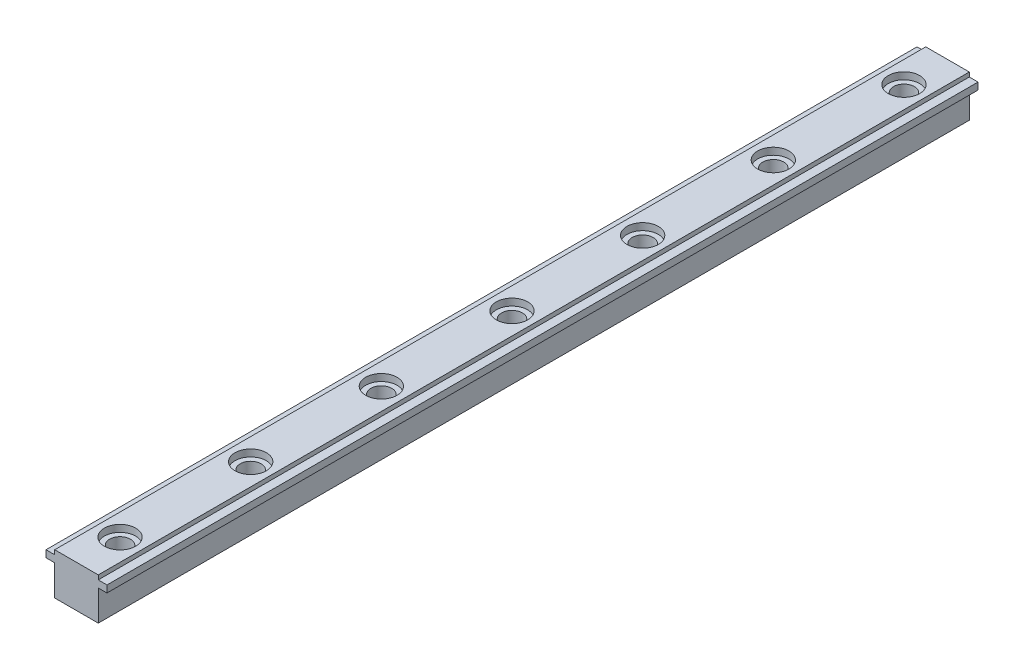
ISO-10303-21;
HEADER;
FILE_DESCRIPTION(('STEP AP214'),'2;1');
FILE_NAME('part.step','',(''),(''),'','','');
FILE_SCHEMA(('AUTOMOTIVE_DESIGN { 1 0 10303 214 1 1 1 1 }'));
ENDSEC;
DATA;
#1=APPLICATION_CONTEXT('core data for automotive mechanical design processes');
#2=APPLICATION_PROTOCOL_DEFINITION('international standard','automotive_design',2000,#1);
#3=PRODUCT_CONTEXT('',#1,'mechanical');
#4=PRODUCT('Part','Part','',(#3));
#5=PRODUCT_RELATED_PRODUCT_CATEGORY('part','',(#4));
#6=PRODUCT_DEFINITION_FORMATION('','',#4);
#7=PRODUCT_DEFINITION_CONTEXT('part definition',#1,'design');
#8=PRODUCT_DEFINITION('design','',#6,#7);
#9=PRODUCT_DEFINITION_SHAPE('','',#8);
#10=(LENGTH_UNIT() NAMED_UNIT(*) SI_UNIT(.MILLI.,.METRE.));
#11=(NAMED_UNIT(*) PLANE_ANGLE_UNIT() SI_UNIT($,.RADIAN.));
#12=(NAMED_UNIT(*) SI_UNIT($,.STERADIAN.) SOLID_ANGLE_UNIT());
#13=UNCERTAINTY_MEASURE_WITH_UNIT(LENGTH_MEASURE(1.E-05),#10,'distance_accuracy_value','');
#14=(GEOMETRIC_REPRESENTATION_CONTEXT(3) GLOBAL_UNCERTAINTY_ASSIGNED_CONTEXT((#13)) GLOBAL_UNIT_ASSIGNED_CONTEXT((#10,
#11,#12)) REPRESENTATION_CONTEXT('',''));
#15=CARTESIAN_POINT('',(0.,0.,0.));
#16=DIRECTION('',(0.,0.,1.));
#17=DIRECTION('',(1.,0.,0.));
#18=AXIS2_PLACEMENT_3D('',#15,#16,#17);
#19=CARTESIAN_POINT('',(-0.159883720930234,-53.531976744186,65.));
#20=DIRECTION('',(0.,1.,0.));
#21=DIRECTION('',(0.,0.,1.));
#22=AXIS2_PLACEMENT_3D('',#19,#20,#21);
#23=CYLINDRICAL_SURFACE('',#22,1.20000000000002);
#24=CARTESIAN_POINT('',(-0.159883720930234,-3.33197674418605,65.));
#25=DIRECTION('',(0.,1.,0.));
#26=DIRECTION('',(-1.,0.,0.));
#27=AXIS2_PLACEMENT_3D('',#24,#25,#26);
#28=CIRCLE('',#27,1.20000000000002);
#29=CARTESIAN_POINT('',(-1.35988372093026,-3.33197674418605,65.));
#30=VERTEX_POINT('',#29);
#31=EDGE_CURVE('E788',#30,#30,#28,.T.);
#32=ORIENTED_EDGE('',*,*,#31,.F.);
#33=EDGE_LOOP('',(#32));
#34=FACE_BOUND('',#33,.T.);
#35=CARTESIAN_POINT('',(-0.159883720930234,0.668023255813954,65.));
#36=DIRECTION('',(0.,1.,0.));
#37=DIRECTION('',(0.,0.,1.));
#38=AXIS2_PLACEMENT_3D('',#35,#36,#37);
#39=CIRCLE('',#38,1.20000000000002);
#40=CARTESIAN_POINT('',(-0.159883720930234,0.668023255813954,66.2));
#41=VERTEX_POINT('',#40);
#42=EDGE_CURVE('E800',#41,#41,#39,.F.);
#43=ORIENTED_EDGE('',*,*,#42,.F.);
#44=EDGE_LOOP('',(#43));
#45=FACE_BOUND('',#44,.T.);
#46=ADVANCED_FACE('F78',(#34,#45),#23,.F.);
#47=CARTESIAN_POINT('',(-0.159883720930234,-53.531976744186,50.));
#48=DIRECTION('',(0.,1.,0.));
#49=DIRECTION('',(0.,0.,1.));
#50=AXIS2_PLACEMENT_3D('',#47,#48,#49);
#51=CYLINDRICAL_SURFACE('',#50,1.20000000000002);
#52=CARTESIAN_POINT('',(-0.159883720930234,-3.33197674418605,50.));
#53=DIRECTION('',(0.,1.,0.));
#54=DIRECTION('',(-1.,0.,0.));
#55=AXIS2_PLACEMENT_3D('',#52,#53,#54);
#56=CIRCLE('',#55,1.20000000000002);
#57=CARTESIAN_POINT('',(-1.35988372093026,-3.33197674418605,50.));
#58=VERTEX_POINT('',#57);
#59=EDGE_CURVE('E785',#58,#58,#56,.T.);
#60=ORIENTED_EDGE('',*,*,#59,.F.);
#61=EDGE_LOOP('',(#60));
#62=FACE_BOUND('',#61,.T.);
#63=CARTESIAN_POINT('',(-0.159883720930234,0.668023255813954,50.));
#64=DIRECTION('',(0.,1.,0.));
#65=DIRECTION('',(0.,0.,1.));
#66=AXIS2_PLACEMENT_3D('',#63,#64,#65);
#67=CIRCLE('',#66,1.20000000000002);
#68=CARTESIAN_POINT('',(-0.159883720930234,0.668023255813954,51.2));
#69=VERTEX_POINT('',#68);
#70=EDGE_CURVE('E793',#69,#69,#67,.F.);
#71=ORIENTED_EDGE('',*,*,#70,.F.);
#72=EDGE_LOOP('',(#71));
#73=FACE_BOUND('',#72,.T.);
#74=ADVANCED_FACE('F311',(#62,#73),#51,.F.);
#75=CARTESIAN_POINT('',(-0.159883720930234,-53.531976744186,95.));
#76=DIRECTION('',(0.,1.,0.));
#77=DIRECTION('',(0.,0.,1.));
#78=AXIS2_PLACEMENT_3D('',#75,#76,#77);
#79=CYLINDRICAL_SURFACE('',#78,1.20000000000002);
#80=CARTESIAN_POINT('',(-0.159883720930234,-3.33197674418605,95.));
#81=DIRECTION('',(0.,1.,0.));
#82=DIRECTION('',(-1.,0.,0.));
#83=AXIS2_PLACEMENT_3D('',#80,#81,#82);
#84=CIRCLE('',#83,1.20000000000002);
#85=CARTESIAN_POINT('',(-1.35988372093026,-3.33197674418605,95.));
#86=VERTEX_POINT('',#85);
#87=EDGE_CURVE('E756',#86,#86,#84,.T.);
#88=ORIENTED_EDGE('',*,*,#87,.F.);
#89=EDGE_LOOP('',(#88));
#90=FACE_BOUND('',#89,.T.);
#91=CARTESIAN_POINT('',(-0.159883720930234,0.668023255813954,95.));
#92=DIRECTION('',(0.,1.,0.));
#93=DIRECTION('',(0.,0.,1.));
#94=AXIS2_PLACEMENT_3D('',#91,#92,#93);
#95=CIRCLE('',#94,1.20000000000002);
#96=CARTESIAN_POINT('',(-0.159883720930234,0.668023255813954,96.2));
#97=VERTEX_POINT('',#96);
#98=EDGE_CURVE('E814',#97,#97,#95,.F.);
#99=ORIENTED_EDGE('',*,*,#98,.F.);
#100=EDGE_LOOP('',(#99));
#101=FACE_BOUND('',#100,.T.);
#102=ADVANCED_FACE('F317',(#90,#101),#79,.F.);
#103=CARTESIAN_POINT('',(-0.159883720930234,-53.531976744186,80.));
#104=DIRECTION('',(0.,1.,0.));
#105=DIRECTION('',(0.,0.,1.));
#106=AXIS2_PLACEMENT_3D('',#103,#104,#105);
#107=CYLINDRICAL_SURFACE('',#106,1.20000000000002);
#108=CARTESIAN_POINT('',(-0.159883720930234,-3.33197674418605,80.));
#109=DIRECTION('',(0.,1.,0.));
#110=DIRECTION('',(-1.,0.,0.));
#111=AXIS2_PLACEMENT_3D('',#108,#109,#110);
#112=CIRCLE('',#111,1.20000000000002);
#113=CARTESIAN_POINT('',(-1.35988372093026,-3.33197674418605,80.));
#114=VERTEX_POINT('',#113);
#115=EDGE_CURVE('E750',#114,#114,#112,.T.);
#116=ORIENTED_EDGE('',*,*,#115,.F.);
#117=EDGE_LOOP('',(#116));
#118=FACE_BOUND('',#117,.T.);
#119=CARTESIAN_POINT('',(-0.159883720930234,0.668023255813954,80.));
#120=DIRECTION('',(0.,1.,0.));
#121=DIRECTION('',(0.,0.,1.));
#122=AXIS2_PLACEMENT_3D('',#119,#120,#121);
#123=CIRCLE('',#122,1.20000000000002);
#124=CARTESIAN_POINT('',(-0.159883720930234,0.668023255813954,81.2));
#125=VERTEX_POINT('',#124);
#126=EDGE_CURVE('E807',#125,#125,#123,.F.);
#127=ORIENTED_EDGE('',*,*,#126,.F.);
#128=EDGE_LOOP('',(#127));
#129=FACE_BOUND('',#128,.T.);
#130=ADVANCED_FACE('F323',(#118,#129),#107,.F.);
#131=CARTESIAN_POINT('',(-0.159883720930234,-53.531976744186,35.));
#132=DIRECTION('',(0.,1.,0.));
#133=DIRECTION('',(0.,0.,1.));
#134=AXIS2_PLACEMENT_3D('',#131,#132,#133);
#135=CYLINDRICAL_SURFACE('',#134,1.20000000000002);
#136=CARTESIAN_POINT('',(-0.159883720930234,-3.33197674418605,35.));
#137=DIRECTION('',(0.,1.,0.));
#138=DIRECTION('',(-1.,0.,0.));
#139=AXIS2_PLACEMENT_3D('',#136,#137,#138);
#140=CIRCLE('',#139,1.20000000000002);
#141=CARTESIAN_POINT('',(-1.35988372093026,-3.33197674418605,35.));
#142=VERTEX_POINT('',#141);
#143=EDGE_CURVE('E760',#142,#142,#140,.T.);
#144=ORIENTED_EDGE('',*,*,#143,.F.);
#145=EDGE_LOOP('',(#144));
#146=FACE_BOUND('',#145,.T.);
#147=CARTESIAN_POINT('',(-0.159883720930234,0.668023255813954,35.));
#148=DIRECTION('',(0.,1.,0.));
#149=DIRECTION('',(0.,0.,1.));
#150=AXIS2_PLACEMENT_3D('',#147,#148,#149);
#151=CIRCLE('',#150,1.20000000000002);
#152=CARTESIAN_POINT('',(-0.159883720930234,0.668023255813954,36.2));
#153=VERTEX_POINT('',#152);
#154=EDGE_CURVE('E749',#153,#153,#151,.F.);
#155=ORIENTED_EDGE('',*,*,#154,.F.);
#156=EDGE_LOOP('',(#155));
#157=FACE_BOUND('',#156,.T.);
#158=ADVANCED_FACE('F358',(#146,#157),#135,.F.);
#159=CARTESIAN_POINT('',(-0.159883720930234,-53.531976744186,20.));
#160=DIRECTION('',(0.,1.,0.));
#161=DIRECTION('',(0.,0.,1.));
#162=AXIS2_PLACEMENT_3D('',#159,#160,#161);
#163=CYLINDRICAL_SURFACE('',#162,1.2);
#164=CARTESIAN_POINT('',(-0.159883720930234,-3.33197674418605,20.));
#165=DIRECTION('',(0.,1.,0.));
#166=DIRECTION('',(-1.,0.,0.));
#167=AXIS2_PLACEMENT_3D('',#164,#165,#166);
#168=CIRCLE('',#167,1.2);
#169=CARTESIAN_POINT('',(-1.35988372093023,-3.33197674418605,20.));
#170=VERTEX_POINT('',#169);
#171=EDGE_CURVE('E197',#170,#170,#168,.T.);
#172=ORIENTED_EDGE('',*,*,#171,.F.);
#173=EDGE_LOOP('',(#172));
#174=FACE_BOUND('',#173,.T.);
#175=CARTESIAN_POINT('',(-0.159883720930234,0.668023255813954,20.));
#176=DIRECTION('',(0.,1.,0.));
#177=DIRECTION('',(0.,0.,1.));
#178=AXIS2_PLACEMENT_3D('',#175,#176,#177);
#179=CIRCLE('',#178,1.2);
#180=CARTESIAN_POINT('',(-0.159883720930234,0.668023255813954,21.2));
#181=VERTEX_POINT('',#180);
#182=EDGE_CURVE('E770',#181,#181,#179,.F.);
#183=ORIENTED_EDGE('',*,*,#182,.F.);
#184=EDGE_LOOP('',(#183));
#185=FACE_BOUND('',#184,.T.);
#186=ADVANCED_FACE('F354',(#174,#185),#163,.F.);
#187=CARTESIAN_POINT('',(-0.159883720930234,-53.531976744186,5.));
#188=DIRECTION('',(0.,1.,0.));
#189=DIRECTION('',(0.,0.,1.));
#190=AXIS2_PLACEMENT_3D('',#187,#188,#189);
#191=CYLINDRICAL_SURFACE('',#190,1.2);
#192=CARTESIAN_POINT('',(-0.159883720930234,-3.33197674418605,5.));
#193=DIRECTION('',(0.,1.,0.));
#194=DIRECTION('',(-1.,0.,0.));
#195=AXIS2_PLACEMENT_3D('',#192,#193,#194);
#196=CIRCLE('',#195,1.2);
#197=CARTESIAN_POINT('',(-1.35988372093023,-3.33197674418605,5.));
#198=VERTEX_POINT('',#197);
#199=EDGE_CURVE('E194',#198,#198,#196,.F.);
#200=ORIENTED_EDGE('',*,*,#199,.T.);
#201=EDGE_LOOP('',(#200));
#202=FACE_BOUND('',#201,.T.);
#203=CARTESIAN_POINT('',(-0.159883720930234,0.668023255813954,5.));
#204=DIRECTION('',(0.,1.,0.));
#205=DIRECTION('',(0.,0.,1.));
#206=AXIS2_PLACEMENT_3D('',#203,#204,#205);
#207=CIRCLE('',#206,1.2);
#208=CARTESIAN_POINT('',(-0.159883720930234,0.668023255813954,6.2));
#209=VERTEX_POINT('',#208);
#210=EDGE_CURVE('E778',#209,#209,#207,.F.);
#211=ORIENTED_EDGE('',*,*,#210,.F.);
#212=EDGE_LOOP('',(#211));
#213=FACE_BOUND('',#212,.T.);
#214=ADVANCED_FACE('F351',(#202,#213),#191,.F.);
#215=CARTESIAN_POINT('',(0.,-3.33197674418605,40.));
#216=DIRECTION('',(0.,1.,0.));
#217=DIRECTION('',(-1.,0.,0.));
#218=AXIS2_PLACEMENT_3D('',#215,#216,#217);
#219=PLANE('',#218);
#220=ORIENTED_EDGE('',*,*,#115,.T.);
#221=EDGE_LOOP('',(#220));
#222=FACE_BOUND('',#221,.T.);
#223=ORIENTED_EDGE('',*,*,#87,.T.);
#224=EDGE_LOOP('',(#223));
#225=FACE_BOUND('',#224,.T.);
#226=ORIENTED_EDGE('',*,*,#59,.T.);
#227=EDGE_LOOP('',(#226));
#228=FACE_BOUND('',#227,.T.);
#229=ORIENTED_EDGE('',*,*,#31,.T.);
#230=EDGE_LOOP('',(#229));
#231=FACE_BOUND('',#230,.T.);
#232=ORIENTED_EDGE('',*,*,#171,.T.);
#233=EDGE_LOOP('',(#232));
#234=FACE_BOUND('',#233,.T.);
#235=ORIENTED_EDGE('',*,*,#143,.T.);
#236=EDGE_LOOP('',(#235));
#237=FACE_BOUND('',#236,.T.);
#238=DIRECTION('',(1.,0.,0.));
#239=VECTOR('',#238,1.);
#240=CARTESIAN_POINT('',(0.,-3.33197674418605,0.));
#241=LINE('',#240,#239);
#242=CARTESIAN_POINT('',(-2.65988372093023,-3.33197674418605,0.));
#243=VERTEX_POINT('',#242);
#244=CARTESIAN_POINT('',(2.34011627906977,-3.33197674418604,0.));
#245=VERTEX_POINT('',#244);
#246=EDGE_CURVE('E184',#243,#245,#241,.T.);
#247=ORIENTED_EDGE('',*,*,#246,.T.);
#248=DIRECTION('',(0.,0.,-1.));
#249=VECTOR('',#248,1.);
#250=CARTESIAN_POINT('',(2.34011627906977,-3.33197674418604,40.));
#251=LINE('',#250,#249);
#252=CARTESIAN_POINT('',(2.34011627906977,-3.33197674418604,100.));
#253=VERTEX_POINT('',#252);
#254=EDGE_CURVE('E237',#253,#245,#251,.T.);
#255=ORIENTED_EDGE('',*,*,#254,.F.);
#256=DIRECTION('',(1.,0.,0.));
#257=VECTOR('',#256,1.);
#258=CARTESIAN_POINT('',(0.,-3.33197674418605,100.));
#259=LINE('',#258,#257);
#260=CARTESIAN_POINT('',(-2.65988372093023,-3.33197674418605,100.));
#261=VERTEX_POINT('',#260);
#262=EDGE_CURVE('E263',#261,#253,#259,.T.);
#263=ORIENTED_EDGE('',*,*,#262,.F.);
#264=DIRECTION('',(0.,0.,-1.));
#265=VECTOR('',#264,1.);
#266=CARTESIAN_POINT('',(-2.65988372093023,-3.33197674418605,40.));
#267=LINE('',#266,#265);
#268=EDGE_CURVE('E88',#261,#243,#267,.T.);
#269=ORIENTED_EDGE('',*,*,#268,.T.);
#270=EDGE_LOOP('',(#247,#255,#263,#269));
#271=FACE_BOUND('',#270,.T.);
#272=ORIENTED_EDGE('',*,*,#199,.F.);
#273=EDGE_LOOP('',(#272));
#274=FACE_BOUND('',#273,.T.);
#275=ADVANCED_FACE('F269',(#222,#225,#228,#231,#234,#237,#271,#274),#219,.F.);
#276=CARTESIAN_POINT('',(0.,1.46802325581395,40.));
#277=DIRECTION('',(0.,1.,0.));
#278=DIRECTION('',(0.,0.,1.));
#279=AXIS2_PLACEMENT_3D('',#276,#277,#278);
#280=PLANE('',#279);
#281=CARTESIAN_POINT('',(-0.159883720930234,1.46802325581395,95.));
#282=DIRECTION('',(0.,1.,0.));
#283=DIRECTION('',(0.,0.,1.));
#284=AXIS2_PLACEMENT_3D('',#281,#282,#283);
#285=CIRCLE('',#284,1.79999999999999);
#286=CARTESIAN_POINT('',(-0.159883720930234,1.46802325581395,96.8));
#287=VERTEX_POINT('',#286);
#288=EDGE_CURVE('E724',#287,#287,#285,.T.);
#289=ORIENTED_EDGE('',*,*,#288,.F.);
#290=EDGE_LOOP('',(#289));
#291=FACE_BOUND('',#290,.T.);
#292=CARTESIAN_POINT('',(-0.159883720930234,1.46802325581395,50.));
#293=DIRECTION('',(0.,1.,0.));
#294=DIRECTION('',(0.,0.,1.));
#295=AXIS2_PLACEMENT_3D('',#292,#293,#294);
#296=CIRCLE('',#295,1.79999999999999);
#297=CARTESIAN_POINT('',(-0.159883720930234,1.46802325581395,51.8));
#298=VERTEX_POINT('',#297);
#299=EDGE_CURVE('E728',#298,#298,#296,.T.);
#300=ORIENTED_EDGE('',*,*,#299,.F.);
#301=EDGE_LOOP('',(#300));
#302=FACE_BOUND('',#301,.T.);
#303=CARTESIAN_POINT('',(-0.159883720930234,1.46802325581395,80.));
#304=DIRECTION('',(0.,1.,0.));
#305=DIRECTION('',(0.,0.,1.));
#306=AXIS2_PLACEMENT_3D('',#303,#304,#305);
#307=CIRCLE('',#306,1.79999999999999);
#308=CARTESIAN_POINT('',(-0.159883720930234,1.46802325581395,81.8));
#309=VERTEX_POINT('',#308);
#310=EDGE_CURVE('E732',#309,#309,#307,.T.);
#311=ORIENTED_EDGE('',*,*,#310,.F.);
#312=EDGE_LOOP('',(#311));
#313=FACE_BOUND('',#312,.T.);
#314=CARTESIAN_POINT('',(-0.159883720930234,1.46802325581395,65.));
#315=DIRECTION('',(0.,1.,0.));
#316=DIRECTION('',(0.,0.,1.));
#317=AXIS2_PLACEMENT_3D('',#314,#315,#316);
#318=CIRCLE('',#317,1.79999999999999);
#319=CARTESIAN_POINT('',(-0.159883720930234,1.46802325581395,66.8));
#320=VERTEX_POINT('',#319);
#321=EDGE_CURVE('E736',#320,#320,#318,.T.);
#322=ORIENTED_EDGE('',*,*,#321,.F.);
#323=EDGE_LOOP('',(#322));
#324=FACE_BOUND('',#323,.T.);
#325=CARTESIAN_POINT('',(-0.159883720930234,1.46802325581395,5.));
#326=DIRECTION('',(0.,1.,0.));
#327=DIRECTION('',(0.,0.,1.));
#328=AXIS2_PLACEMENT_3D('',#325,#326,#327);
#329=CIRCLE('',#328,1.8);
#330=CARTESIAN_POINT('',(-0.159883720930234,1.46802325581395,6.8));
#331=VERTEX_POINT('',#330);
#332=EDGE_CURVE('E740',#331,#331,#329,.T.);
#333=ORIENTED_EDGE('',*,*,#332,.F.);
#334=EDGE_LOOP('',(#333));
#335=FACE_BOUND('',#334,.T.);
#336=CARTESIAN_POINT('',(-0.159883720930234,1.46802325581395,20.));
#337=DIRECTION('',(0.,1.,0.));
#338=DIRECTION('',(0.,0.,1.));
#339=AXIS2_PLACEMENT_3D('',#336,#337,#338);
#340=CIRCLE('',#339,1.80000000000001);
#341=CARTESIAN_POINT('',(-0.159883720930234,1.46802325581395,21.8));
#342=VERTEX_POINT('',#341);
#343=EDGE_CURVE('E744',#342,#342,#340,.T.);
#344=ORIENTED_EDGE('',*,*,#343,.F.);
#345=EDGE_LOOP('',(#344));
#346=FACE_BOUND('',#345,.T.);
#347=CARTESIAN_POINT('',(-0.159883720930234,1.46802325581395,35.));
#348=DIRECTION('',(0.,1.,0.));
#349=DIRECTION('',(0.,0.,1.));
#350=AXIS2_PLACEMENT_3D('',#347,#348,#349);
#351=CIRCLE('',#350,1.79999999999999);
#352=CARTESIAN_POINT('',(-0.159883720930234,1.46802325581395,36.8));
#353=VERTEX_POINT('',#352);
#354=EDGE_CURVE('E747',#353,#353,#351,.T.);
#355=ORIENTED_EDGE('',*,*,#354,.F.);
#356=EDGE_LOOP('',(#355));
#357=FACE_BOUND('',#356,.T.);
#358=DIRECTION('',(1.,0.,0.));
#359=VECTOR('',#358,1.);
#360=CARTESIAN_POINT('',(0.,1.46802325581395,0.));
#361=LINE('',#360,#359);
#362=CARTESIAN_POINT('',(-2.65988372093023,1.46802325581395,0.));
#363=VERTEX_POINT('',#362);
#364=CARTESIAN_POINT('',(2.34011627906977,1.46802325581395,0.));
#365=VERTEX_POINT('',#364);
#366=EDGE_CURVE('E214',#363,#365,#361,.T.);
#367=ORIENTED_EDGE('',*,*,#366,.F.);
#368=DIRECTION('',(0.,0.,-1.));
#369=VECTOR('',#368,1.);
#370=CARTESIAN_POINT('',(-2.65988372093023,1.46802325581395,40.));
#371=LINE('',#370,#369);
#372=CARTESIAN_POINT('',(-2.65988372093023,1.46802325581395,100.));
#373=VERTEX_POINT('',#372);
#374=EDGE_CURVE('E225',#373,#363,#371,.T.);
#375=ORIENTED_EDGE('',*,*,#374,.F.);
#376=DIRECTION('',(1.,0.,0.));
#377=VECTOR('',#376,1.);
#378=CARTESIAN_POINT('',(0.,1.46802325581395,100.));
#379=LINE('',#378,#377);
#380=CARTESIAN_POINT('',(2.34011627906977,1.46802325581395,100.));
#381=VERTEX_POINT('',#380);
#382=EDGE_CURVE('E246',#373,#381,#379,.T.);
#383=ORIENTED_EDGE('',*,*,#382,.T.);
#384=DIRECTION('',(0.,0.,-1.));
#385=VECTOR('',#384,1.);
#386=CARTESIAN_POINT('',(2.34011627906977,1.46802325581395,40.));
#387=LINE('',#386,#385);
#388=EDGE_CURVE('E227',#381,#365,#387,.T.);
#389=ORIENTED_EDGE('',*,*,#388,.T.);
#390=EDGE_LOOP('',(#367,#375,#383,#389));
#391=FACE_BOUND('',#390,.T.);
#392=ADVANCED_FACE('F293',(#291,#302,#313,#324,#335,#346,#357,#391),#280,.T.);
#393=CARTESIAN_POINT('',(0.,0.168023255813954,40.));
#394=DIRECTION('',(0.,1.,0.));
#395=DIRECTION('',(-1.,0.,0.));
#396=AXIS2_PLACEMENT_3D('',#393,#394,#395);
#397=PLANE('',#396);
#398=DIRECTION('',(1.,0.,0.));
#399=VECTOR('',#398,1.);
#400=CARTESIAN_POINT('',(0.,0.168023255813954,0.));
#401=LINE('',#400,#399);
#402=CARTESIAN_POINT('',(-3.65988372093023,0.168023255813954,0.));
#403=VERTEX_POINT('',#402);
#404=CARTESIAN_POINT('',(-2.65988372093023,0.168023255813954,0.));
#405=VERTEX_POINT('',#404);
#406=EDGE_CURVE('E181',#403,#405,#401,.T.);
#407=ORIENTED_EDGE('',*,*,#406,.T.);
#408=DIRECTION('',(0.,0.,-1.));
#409=VECTOR('',#408,1.);
#410=CARTESIAN_POINT('',(-2.65988372093023,0.168023255813954,40.));
#411=LINE('',#410,#409);
#412=CARTESIAN_POINT('',(-2.65988372093023,0.168023255813954,100.));
#413=VERTEX_POINT('',#412);
#414=EDGE_CURVE('E13',#413,#405,#411,.T.);
#415=ORIENTED_EDGE('',*,*,#414,.F.);
#416=DIRECTION('',(1.,0.,0.));
#417=VECTOR('',#416,1.);
#418=CARTESIAN_POINT('',(0.,0.168023255813954,100.));
#419=LINE('',#418,#417);
#420=CARTESIAN_POINT('',(-3.65988372093023,0.168023255813954,100.));
#421=VERTEX_POINT('',#420);
#422=EDGE_CURVE('E219',#421,#413,#419,.T.);
#423=ORIENTED_EDGE('',*,*,#422,.F.);
#424=DIRECTION('',(0.,0.,-1.));
#425=VECTOR('',#424,1.);
#426=CARTESIAN_POINT('',(-3.65988372093023,0.168023255813954,40.));
#427=LINE('',#426,#425);
#428=EDGE_CURVE('E193',#421,#403,#427,.T.);
#429=ORIENTED_EDGE('',*,*,#428,.T.);
#430=EDGE_LOOP('',(#407,#415,#423,#429));
#431=FACE_BOUND('',#430,.T.);
#432=ADVANCED_FACE('F192',(#431),#397,.F.);
#433=CARTESIAN_POINT('',(-2.65988372093023,0.,40.));
#434=DIRECTION('',(1.,0.,0.));
#435=DIRECTION('',(0.,1.,0.));
#436=AXIS2_PLACEMENT_3D('',#433,#434,#435);
#437=PLANE('',#436);
#438=DIRECTION('',(0.,-1.,0.));
#439=VECTOR('',#438,1.);
#440=CARTESIAN_POINT('',(-2.65988372093023,0.,0.));
#441=LINE('',#440,#439);
#442=EDGE_CURVE('E178',#405,#243,#441,.T.);
#443=ORIENTED_EDGE('',*,*,#442,.T.);
#444=ORIENTED_EDGE('',*,*,#268,.F.);
#445=DIRECTION('',(0.,-1.,0.));
#446=VECTOR('',#445,1.);
#447=CARTESIAN_POINT('',(-2.65988372093023,0.,100.));
#448=LINE('',#447,#446);
#449=EDGE_CURVE('E82',#413,#261,#448,.T.);
#450=ORIENTED_EDGE('',*,*,#449,.F.);
#451=ORIENTED_EDGE('',*,*,#414,.T.);
#452=EDGE_LOOP('',(#443,#444,#450,#451));
#453=FACE_BOUND('',#452,.T.);
#454=ADVANCED_FACE('F189',(#453),#437,.F.);
#455=CARTESIAN_POINT('',(2.34011627906977,0.,40.));
#456=DIRECTION('',(1.,0.,0.));
#457=DIRECTION('',(0.,1.,0.));
#458=AXIS2_PLACEMENT_3D('',#455,#456,#457);
#459=PLANE('',#458);
#460=DIRECTION('',(0.,-1.,0.));
#461=VECTOR('',#460,1.);
#462=CARTESIAN_POINT('',(2.34011627906977,0.,0.));
#463=LINE('',#462,#461);
#464=CARTESIAN_POINT('',(2.34011627906977,0.168023255813954,0.));
#465=VERTEX_POINT('',#464);
#466=EDGE_CURVE('E202',#465,#245,#463,.T.);
#467=ORIENTED_EDGE('',*,*,#466,.F.);
#468=DIRECTION('',(0.,0.,-1.));
#469=VECTOR('',#468,1.);
#470=CARTESIAN_POINT('',(2.34011627906977,0.168023255813954,40.));
#471=LINE('',#470,#469);
#472=CARTESIAN_POINT('',(2.34011627906977,0.168023255813954,100.));
#473=VERTEX_POINT('',#472);
#474=EDGE_CURVE('E235',#473,#465,#471,.T.);
#475=ORIENTED_EDGE('',*,*,#474,.F.);
#476=DIRECTION('',(0.,-1.,0.));
#477=VECTOR('',#476,1.);
#478=CARTESIAN_POINT('',(2.34011627906977,0.,100.));
#479=LINE('',#478,#477);
#480=EDGE_CURVE('E261',#473,#253,#479,.T.);
#481=ORIENTED_EDGE('',*,*,#480,.T.);
#482=ORIENTED_EDGE('',*,*,#254,.T.);
#483=EDGE_LOOP('',(#467,#475,#481,#482));
#484=FACE_BOUND('',#483,.T.);
#485=ADVANCED_FACE('F273',(#484),#459,.T.);
#486=CARTESIAN_POINT('',(0.,0.168023255813954,40.));
#487=DIRECTION('',(0.,-1.,0.));
#488=DIRECTION('',(1.,0.,0.));
#489=AXIS2_PLACEMENT_3D('',#486,#487,#488);
#490=PLANE('',#489);
#491=DIRECTION('',(-1.,0.,0.));
#492=VECTOR('',#491,1.);
#493=CARTESIAN_POINT('',(0.,0.168023255813954,0.));
#494=LINE('',#493,#492);
#495=CARTESIAN_POINT('',(3.34011627906977,0.168023255813954,0.));
#496=VERTEX_POINT('',#495);
#497=EDGE_CURVE('E204',#496,#465,#494,.T.);
#498=ORIENTED_EDGE('',*,*,#497,.F.);
#499=DIRECTION('',(0.,0.,-1.));
#500=VECTOR('',#499,1.);
#501=CARTESIAN_POINT('',(3.34011627906977,0.168023255813954,40.));
#502=LINE('',#501,#500);
#503=CARTESIAN_POINT('',(3.34011627906977,0.168023255813954,100.));
#504=VERTEX_POINT('',#503);
#505=EDGE_CURVE('E233',#504,#496,#502,.T.);
#506=ORIENTED_EDGE('',*,*,#505,.F.);
#507=DIRECTION('',(-1.,0.,0.));
#508=VECTOR('',#507,1.);
#509=CARTESIAN_POINT('',(0.,0.168023255813954,100.));
#510=LINE('',#509,#508);
#511=EDGE_CURVE('E258',#504,#473,#510,.T.);
#512=ORIENTED_EDGE('',*,*,#511,.T.);
#513=ORIENTED_EDGE('',*,*,#474,.T.);
#514=EDGE_LOOP('',(#498,#506,#512,#513));
#515=FACE_BOUND('',#514,.T.);
#516=ADVANCED_FACE('F276',(#515),#490,.T.);
#517=CARTESIAN_POINT('',(3.34011627906977,0.,40.));
#518=DIRECTION('',(1.,0.,0.));
#519=DIRECTION('',(0.,0.,-1.));
#520=AXIS2_PLACEMENT_3D('',#517,#518,#519);
#521=PLANE('',#520);
#522=DIRECTION('',(0.,-1.,0.));
#523=VECTOR('',#522,1.);
#524=CARTESIAN_POINT('',(3.34011627906977,0.,0.));
#525=LINE('',#524,#523);
#526=CARTESIAN_POINT('',(3.34011627906977,0.968023255813954,0.));
#527=VERTEX_POINT('',#526);
#528=EDGE_CURVE('E208',#527,#496,#525,.T.);
#529=ORIENTED_EDGE('',*,*,#528,.F.);
#530=DIRECTION('',(0.,0.,-1.));
#531=VECTOR('',#530,1.);
#532=CARTESIAN_POINT('',(3.34011627906977,0.968023255813954,40.));
#533=LINE('',#532,#531);
#534=CARTESIAN_POINT('',(3.34011627906977,0.968023255813954,100.));
#535=VERTEX_POINT('',#534);
#536=EDGE_CURVE('E231',#535,#527,#533,.T.);
#537=ORIENTED_EDGE('',*,*,#536,.F.);
#538=DIRECTION('',(0.,-1.,0.));
#539=VECTOR('',#538,1.);
#540=CARTESIAN_POINT('',(3.34011627906977,0.,100.));
#541=LINE('',#540,#539);
#542=EDGE_CURVE('E255',#535,#504,#541,.T.);
#543=ORIENTED_EDGE('',*,*,#542,.T.);
#544=ORIENTED_EDGE('',*,*,#505,.T.);
#545=EDGE_LOOP('',(#529,#537,#543,#544));
#546=FACE_BOUND('',#545,.T.);
#547=ADVANCED_FACE('F281',(#546),#521,.T.);
#548=CARTESIAN_POINT('',(0.,0.968023255813954,40.));
#549=DIRECTION('',(0.,1.,0.));
#550=DIRECTION('',(0.,0.,1.));
#551=AXIS2_PLACEMENT_3D('',#548,#549,#550);
#552=PLANE('',#551);
#553=DIRECTION('',(1.,0.,0.));
#554=VECTOR('',#553,1.);
#555=CARTESIAN_POINT('',(0.,0.968023255813954,0.));
#556=LINE('',#555,#554);
#557=CARTESIAN_POINT('',(2.34011627906977,0.968023255813954,0.));
#558=VERTEX_POINT('',#557);
#559=EDGE_CURVE('E211',#558,#527,#556,.T.);
#560=ORIENTED_EDGE('',*,*,#559,.F.);
#561=DIRECTION('',(0.,0.,-1.));
#562=VECTOR('',#561,1.);
#563=CARTESIAN_POINT('',(2.34011627906977,0.968023255813954,40.));
#564=LINE('',#563,#562);
#565=CARTESIAN_POINT('',(2.34011627906977,0.968023255813954,100.));
#566=VERTEX_POINT('',#565);
#567=EDGE_CURVE('E229',#566,#558,#564,.T.);
#568=ORIENTED_EDGE('',*,*,#567,.F.);
#569=DIRECTION('',(1.,0.,0.));
#570=VECTOR('',#569,1.);
#571=CARTESIAN_POINT('',(0.,0.968023255813954,100.));
#572=LINE('',#571,#570);
#573=EDGE_CURVE('E252',#566,#535,#572,.T.);
#574=ORIENTED_EDGE('',*,*,#573,.T.);
#575=ORIENTED_EDGE('',*,*,#536,.T.);
#576=EDGE_LOOP('',(#560,#568,#574,#575));
#577=FACE_BOUND('',#576,.T.);
#578=ADVANCED_FACE('F284',(#577),#552,.T.);
#579=EDGE_CURVE('E205',#365,#558,#463,.T.);
#580=ORIENTED_EDGE('',*,*,#579,.F.);
#581=ORIENTED_EDGE('',*,*,#388,.F.);
#582=DIRECTION('',(0.,-1.,0.));
#583=VECTOR('',#582,1.);
#584=CARTESIAN_POINT('',(2.34011627906977,0.,100.));
#585=LINE('',#584,#583);
#586=EDGE_CURVE('E249',#381,#566,#585,.T.);
#587=ORIENTED_EDGE('',*,*,#586,.T.);
#588=ORIENTED_EDGE('',*,*,#567,.T.);
#589=EDGE_LOOP('',(#580,#581,#587,#588));
#590=FACE_BOUND('',#589,.T.);
#591=ADVANCED_FACE('F290',(#590),#459,.T.);
#592=CARTESIAN_POINT('',(-2.65988372093023,0.968023255813954,0.));
#593=VERTEX_POINT('',#592);
#594=EDGE_CURVE('E187',#363,#593,#441,.T.);
#595=ORIENTED_EDGE('',*,*,#594,.T.);
#596=DIRECTION('',(0.,0.,-1.));
#597=VECTOR('',#596,1.);
#598=CARTESIAN_POINT('',(-2.65988372093023,0.968023255813954,40.));
#599=LINE('',#598,#597);
#600=CARTESIAN_POINT('',(-2.65988372093023,0.968023255813954,100.));
#601=VERTEX_POINT('',#600);
#602=EDGE_CURVE('E223',#601,#593,#599,.T.);
#603=ORIENTED_EDGE('',*,*,#602,.F.);
#604=DIRECTION('',(0.,-1.,0.));
#605=VECTOR('',#604,1.);
#606=CARTESIAN_POINT('',(-2.65988372093023,0.,100.));
#607=LINE('',#606,#605);
#608=EDGE_CURVE('E244',#373,#601,#607,.T.);
#609=ORIENTED_EDGE('',*,*,#608,.F.);
#610=ORIENTED_EDGE('',*,*,#374,.T.);
#611=EDGE_LOOP('',(#595,#603,#609,#610));
#612=FACE_BOUND('',#611,.T.);
#613=ADVANCED_FACE('F298',(#612),#437,.F.);
#614=CARTESIAN_POINT('',(0.,0.968023255813954,40.));
#615=DIRECTION('',(0.,-1.,0.));
#616=DIRECTION('',(0.,0.,-1.));
#617=AXIS2_PLACEMENT_3D('',#614,#615,#616);
#618=PLANE('',#617);
#619=DIRECTION('',(-1.,0.,0.));
#620=VECTOR('',#619,1.);
#621=CARTESIAN_POINT('',(0.,0.968023255813954,0.));
#622=LINE('',#621,#620);
#623=CARTESIAN_POINT('',(-3.65988372093023,0.968023255813954,0.));
#624=VERTEX_POINT('',#623);
#625=EDGE_CURVE('E145',#593,#624,#622,.T.);
#626=ORIENTED_EDGE('',*,*,#625,.T.);
#627=DIRECTION('',(0.,0.,-1.));
#628=VECTOR('',#627,1.);
#629=CARTESIAN_POINT('',(-3.65988372093023,0.968023255813954,40.));
#630=LINE('',#629,#628);
#631=CARTESIAN_POINT('',(-3.65988372093023,0.968023255813954,100.));
#632=VERTEX_POINT('',#631);
#633=EDGE_CURVE('E221',#632,#624,#630,.T.);
#634=ORIENTED_EDGE('',*,*,#633,.F.);
#635=DIRECTION('',(-1.,0.,0.));
#636=VECTOR('',#635,1.);
#637=CARTESIAN_POINT('',(0.,0.968023255813954,100.));
#638=LINE('',#637,#636);
#639=EDGE_CURVE('E242',#601,#632,#638,.T.);
#640=ORIENTED_EDGE('',*,*,#639,.F.);
#641=ORIENTED_EDGE('',*,*,#602,.T.);
#642=EDGE_LOOP('',(#626,#634,#640,#641));
#643=FACE_BOUND('',#642,.T.);
#644=ADVANCED_FACE('F300',(#643),#618,.F.);
#645=CARTESIAN_POINT('',(-3.65988372093023,0.,40.));
#646=DIRECTION('',(1.,0.,0.));
#647=DIRECTION('',(0.,0.,-1.));
#648=AXIS2_PLACEMENT_3D('',#645,#646,#647);
#649=PLANE('',#648);
#650=DIRECTION('',(0.,-1.,0.));
#651=VECTOR('',#650,1.);
#652=CARTESIAN_POINT('',(-3.65988372093023,0.,0.));
#653=LINE('',#652,#651);
#654=EDGE_CURVE('E137',#624,#403,#653,.T.);
#655=ORIENTED_EDGE('',*,*,#654,.T.);
#656=ORIENTED_EDGE('',*,*,#428,.F.);
#657=DIRECTION('',(0.,-1.,0.));
#658=VECTOR('',#657,1.);
#659=CARTESIAN_POINT('',(-3.65988372093023,0.,100.));
#660=LINE('',#659,#658);
#661=EDGE_CURVE('E97',#632,#421,#660,.T.);
#662=ORIENTED_EDGE('',*,*,#661,.F.);
#663=ORIENTED_EDGE('',*,*,#633,.T.);
#664=EDGE_LOOP('',(#655,#656,#662,#663));
#665=FACE_BOUND('',#664,.T.);
#666=ADVANCED_FACE('F301',(#665),#649,.F.);
#667=CARTESIAN_POINT('',(0.,0.,100.));
#668=DIRECTION('',(0.,0.,1.));
#669=DIRECTION('',(1.,0.,0.));
#670=AXIS2_PLACEMENT_3D('',#667,#668,#669);
#671=PLANE('',#670);
#672=ORIENTED_EDGE('',*,*,#422,.T.);
#673=ORIENTED_EDGE('',*,*,#449,.T.);
#674=ORIENTED_EDGE('',*,*,#262,.T.);
#675=ORIENTED_EDGE('',*,*,#480,.F.);
#676=ORIENTED_EDGE('',*,*,#511,.F.);
#677=ORIENTED_EDGE('',*,*,#542,.F.);
#678=ORIENTED_EDGE('',*,*,#573,.F.);
#679=ORIENTED_EDGE('',*,*,#586,.F.);
#680=ORIENTED_EDGE('',*,*,#382,.F.);
#681=ORIENTED_EDGE('',*,*,#608,.T.);
#682=ORIENTED_EDGE('',*,*,#639,.T.);
#683=ORIENTED_EDGE('',*,*,#661,.T.);
#684=EDGE_LOOP('',(#672,#673,#674,#675,#676,#677,#678,#679,#680,#681,#682,#683));
#685=FACE_BOUND('',#684,.T.);
#686=ADVANCED_FACE('F80',(#685),#671,.T.);
#687=CARTESIAN_POINT('',(0.,0.,0.));
#688=DIRECTION('',(0.,0.,1.));
#689=DIRECTION('',(1.,0.,0.));
#690=AXIS2_PLACEMENT_3D('',#687,#688,#689);
#691=PLANE('',#690);
#692=ORIENTED_EDGE('',*,*,#406,.F.);
#693=ORIENTED_EDGE('',*,*,#654,.F.);
#694=ORIENTED_EDGE('',*,*,#625,.F.);
#695=ORIENTED_EDGE('',*,*,#594,.F.);
#696=ORIENTED_EDGE('',*,*,#366,.T.);
#697=ORIENTED_EDGE('',*,*,#579,.T.);
#698=ORIENTED_EDGE('',*,*,#559,.T.);
#699=ORIENTED_EDGE('',*,*,#528,.T.);
#700=ORIENTED_EDGE('',*,*,#497,.T.);
#701=ORIENTED_EDGE('',*,*,#466,.T.);
#702=ORIENTED_EDGE('',*,*,#246,.F.);
#703=ORIENTED_EDGE('',*,*,#442,.F.);
#704=EDGE_LOOP('',(#692,#693,#694,#695,#696,#697,#698,#699,#700,#701,#702,#703));
#705=FACE_BOUND('',#704,.T.);
#706=ADVANCED_FACE('F179',(#705),#691,.F.);
#707=CARTESIAN_POINT('',(-0.159883720930234,0.668023255813954,5.));
#708=DIRECTION('',(0.,1.,0.));
#709=DIRECTION('',(0.,0.,1.));
#710=AXIS2_PLACEMENT_3D('',#707,#708,#709);
#711=CYLINDRICAL_SURFACE('',#710,1.8);
#712=CARTESIAN_POINT('',(-0.159883720930234,0.668023255813954,5.));
#713=DIRECTION('',(0.,1.,0.));
#714=DIRECTION('',(0.,0.,1.));
#715=AXIS2_PLACEMENT_3D('',#712,#713,#714);
#716=CIRCLE('',#715,1.8);
#717=CARTESIAN_POINT('',(-0.159883720930234,0.668023255813954,6.8));
#718=VERTEX_POINT('',#717);
#719=EDGE_CURVE('E762',#718,#718,#716,.T.);
#720=ORIENTED_EDGE('',*,*,#719,.F.);
#721=EDGE_LOOP('',(#720));
#722=FACE_BOUND('',#721,.T.);
#723=ORIENTED_EDGE('',*,*,#332,.T.);
#724=EDGE_LOOP('',(#723));
#725=FACE_BOUND('',#724,.T.);
#726=ADVANCED_FACE('F330',(#722,#725),#711,.F.);
#727=CARTESIAN_POINT('',(0.,0.668023255813954,0.));
#728=DIRECTION('',(0.,1.,0.));
#729=DIRECTION('',(0.,0.,1.));
#730=AXIS2_PLACEMENT_3D('',#727,#728,#729);
#731=PLANE('',#730);
#732=ORIENTED_EDGE('',*,*,#210,.T.);
#733=EDGE_LOOP('',(#732));
#734=FACE_BOUND('',#733,.T.);
#735=ORIENTED_EDGE('',*,*,#719,.T.);
#736=EDGE_LOOP('',(#735));
#737=FACE_BOUND('',#736,.T.);
#738=ADVANCED_FACE('F326',(#734,#737),#731,.T.);
#739=CARTESIAN_POINT('',(-0.159883720930234,0.668023255813954,20.));
#740=DIRECTION('',(0.,1.,0.));
#741=DIRECTION('',(0.,0.,1.));
#742=AXIS2_PLACEMENT_3D('',#739,#740,#741);
#743=CYLINDRICAL_SURFACE('',#742,1.80000000000001);
#744=CARTESIAN_POINT('',(-0.159883720930234,0.668023255813954,20.));
#745=DIRECTION('',(0.,1.,0.));
#746=DIRECTION('',(0.,0.,1.));
#747=AXIS2_PLACEMENT_3D('',#744,#745,#746);
#748=CIRCLE('',#747,1.80000000000001);
#749=CARTESIAN_POINT('',(-0.159883720930234,0.668023255813954,21.8));
#750=VERTEX_POINT('',#749);
#751=EDGE_CURVE('E771',#750,#750,#748,.T.);
#752=ORIENTED_EDGE('',*,*,#751,.F.);
#753=EDGE_LOOP('',(#752));
#754=FACE_BOUND('',#753,.T.);
#755=ORIENTED_EDGE('',*,*,#343,.T.);
#756=EDGE_LOOP('',(#755));
#757=FACE_BOUND('',#756,.T.);
#758=ADVANCED_FACE('F329',(#754,#757),#743,.F.);
#759=CARTESIAN_POINT('',(0.,0.668023255813954,0.));
#760=DIRECTION('',(0.,1.,0.));
#761=DIRECTION('',(0.,0.,1.));
#762=AXIS2_PLACEMENT_3D('',#759,#760,#761);
#763=PLANE('',#762);
#764=ORIENTED_EDGE('',*,*,#182,.T.);
#765=EDGE_LOOP('',(#764));
#766=FACE_BOUND('',#765,.T.);
#767=ORIENTED_EDGE('',*,*,#751,.T.);
#768=EDGE_LOOP('',(#767));
#769=FACE_BOUND('',#768,.T.);
#770=ADVANCED_FACE('F335',(#766,#769),#763,.T.);
#771=CARTESIAN_POINT('',(-0.159883720930234,0.668023255813954,35.));
#772=DIRECTION('',(0.,1.,0.));
#773=DIRECTION('',(0.,0.,1.));
#774=AXIS2_PLACEMENT_3D('',#771,#772,#773);
#775=CYLINDRICAL_SURFACE('',#774,1.79999999999999);
#776=CARTESIAN_POINT('',(-0.159883720930234,0.668023255813954,35.));
#777=DIRECTION('',(0.,1.,0.));
#778=DIRECTION('',(0.,0.,1.));
#779=AXIS2_PLACEMENT_3D('',#776,#777,#778);
#780=CIRCLE('',#779,1.79999999999999);
#781=CARTESIAN_POINT('',(-0.159883720930234,0.668023255813954,36.8));
#782=VERTEX_POINT('',#781);
#783=EDGE_CURVE('E753',#782,#782,#780,.T.);
#784=ORIENTED_EDGE('',*,*,#783,.F.);
#785=EDGE_LOOP('',(#784));
#786=FACE_BOUND('',#785,.T.);
#787=ORIENTED_EDGE('',*,*,#354,.T.);
#788=EDGE_LOOP('',(#787));
#789=FACE_BOUND('',#788,.T.);
#790=ADVANCED_FACE('F338',(#786,#789),#775,.F.);
#791=CARTESIAN_POINT('',(0.,0.668023255813954,0.));
#792=DIRECTION('',(0.,1.,0.));
#793=DIRECTION('',(0.,0.,1.));
#794=AXIS2_PLACEMENT_3D('',#791,#792,#793);
#795=PLANE('',#794);
#796=ORIENTED_EDGE('',*,*,#154,.T.);
#797=EDGE_LOOP('',(#796));
#798=FACE_BOUND('',#797,.T.);
#799=ORIENTED_EDGE('',*,*,#783,.T.);
#800=EDGE_LOOP('',(#799));
#801=FACE_BOUND('',#800,.T.);
#802=ADVANCED_FACE('F343',(#798,#801),#795,.T.);
#803=CARTESIAN_POINT('',(-0.159883720930234,0.668023255813954,80.));
#804=DIRECTION('',(0.,1.,0.));
#805=DIRECTION('',(0.,0.,1.));
#806=AXIS2_PLACEMENT_3D('',#803,#804,#805);
#807=CYLINDRICAL_SURFACE('',#806,1.79999999999999);
#808=CARTESIAN_POINT('',(-0.159883720930234,0.668023255813954,80.));
#809=DIRECTION('',(0.,1.,0.));
#810=DIRECTION('',(0.,0.,1.));
#811=AXIS2_PLACEMENT_3D('',#808,#809,#810);
#812=CIRCLE('',#811,1.79999999999999);
#813=CARTESIAN_POINT('',(-0.159883720930234,0.668023255813954,81.8));
#814=VERTEX_POINT('',#813);
#815=EDGE_CURVE('E801',#814,#814,#812,.T.);
#816=ORIENTED_EDGE('',*,*,#815,.F.);
#817=EDGE_LOOP('',(#816));
#818=FACE_BOUND('',#817,.T.);
#819=ORIENTED_EDGE('',*,*,#310,.T.);
#820=EDGE_LOOP('',(#819));
#821=FACE_BOUND('',#820,.T.);
#822=ADVANCED_FACE('F346',(#818,#821),#807,.F.);
#823=CARTESIAN_POINT('',(0.,0.668023255813954,45.));
#824=DIRECTION('',(0.,1.,0.));
#825=DIRECTION('',(0.,0.,1.));
#826=AXIS2_PLACEMENT_3D('',#823,#824,#825);
#827=PLANE('',#826);
#828=ORIENTED_EDGE('',*,*,#126,.T.);
#829=EDGE_LOOP('',(#828));
#830=FACE_BOUND('',#829,.T.);
#831=ORIENTED_EDGE('',*,*,#815,.T.);
#832=EDGE_LOOP('',(#831));
#833=FACE_BOUND('',#832,.T.);
#834=ADVANCED_FACE('F398',(#830,#833),#827,.T.);
#835=CARTESIAN_POINT('',(-0.159883720930234,0.668023255813954,95.));
#836=DIRECTION('',(0.,1.,0.));
#837=DIRECTION('',(0.,0.,1.));
#838=AXIS2_PLACEMENT_3D('',#835,#836,#837);
#839=CYLINDRICAL_SURFACE('',#838,1.79999999999999);
#840=CARTESIAN_POINT('',(-0.159883720930234,0.668023255813954,95.));
#841=DIRECTION('',(0.,1.,0.));
#842=DIRECTION('',(0.,0.,1.));
#843=AXIS2_PLACEMENT_3D('',#840,#841,#842);
#844=CIRCLE('',#843,1.79999999999999);
#845=CARTESIAN_POINT('',(-0.159883720930234,0.668023255813954,96.8));
#846=VERTEX_POINT('',#845);
#847=EDGE_CURVE('E808',#846,#846,#844,.T.);
#848=ORIENTED_EDGE('',*,*,#847,.F.);
#849=EDGE_LOOP('',(#848));
#850=FACE_BOUND('',#849,.T.);
#851=ORIENTED_EDGE('',*,*,#288,.T.);
#852=EDGE_LOOP('',(#851));
#853=FACE_BOUND('',#852,.T.);
#854=ADVANCED_FACE('F407',(#850,#853),#839,.F.);
#855=CARTESIAN_POINT('',(0.,0.668023255813954,60.));
#856=DIRECTION('',(0.,1.,0.));
#857=DIRECTION('',(0.,0.,1.));
#858=AXIS2_PLACEMENT_3D('',#855,#856,#857);
#859=PLANE('',#858);
#860=ORIENTED_EDGE('',*,*,#98,.T.);
#861=EDGE_LOOP('',(#860));
#862=FACE_BOUND('',#861,.T.);
#863=ORIENTED_EDGE('',*,*,#847,.T.);
#864=EDGE_LOOP('',(#863));
#865=FACE_BOUND('',#864,.T.);
#866=ADVANCED_FACE('F415',(#862,#865),#859,.T.);
#867=CARTESIAN_POINT('',(-0.159883720930234,0.668023255813954,50.));
#868=DIRECTION('',(0.,1.,0.));
#869=DIRECTION('',(0.,0.,1.));
#870=AXIS2_PLACEMENT_3D('',#867,#868,#869);
#871=CYLINDRICAL_SURFACE('',#870,1.79999999999999);
#872=CARTESIAN_POINT('',(-0.159883720930234,0.668023255813954,50.));
#873=DIRECTION('',(0.,1.,0.));
#874=DIRECTION('',(0.,0.,1.));
#875=AXIS2_PLACEMENT_3D('',#872,#873,#874);
#876=CIRCLE('',#875,1.79999999999999);
#877=CARTESIAN_POINT('',(-0.159883720930234,0.668023255813954,51.8));
#878=VERTEX_POINT('',#877);
#879=EDGE_CURVE('E791',#878,#878,#876,.T.);
#880=ORIENTED_EDGE('',*,*,#879,.F.);
#881=EDGE_LOOP('',(#880));
#882=FACE_BOUND('',#881,.T.);
#883=ORIENTED_EDGE('',*,*,#299,.T.);
#884=EDGE_LOOP('',(#883));
#885=FACE_BOUND('',#884,.T.);
#886=ADVANCED_FACE('F423',(#882,#885),#871,.F.);
#887=CARTESIAN_POINT('',(0.,0.668023255813954,15.));
#888=DIRECTION('',(0.,1.,0.));
#889=DIRECTION('',(0.,0.,1.));
#890=AXIS2_PLACEMENT_3D('',#887,#888,#889);
#891=PLANE('',#890);
#892=ORIENTED_EDGE('',*,*,#70,.T.);
#893=EDGE_LOOP('',(#892));
#894=FACE_BOUND('',#893,.T.);
#895=ORIENTED_EDGE('',*,*,#879,.T.);
#896=EDGE_LOOP('',(#895));
#897=FACE_BOUND('',#896,.T.);
#898=ADVANCED_FACE('F431',(#894,#897),#891,.T.);
#899=CARTESIAN_POINT('',(-0.159883720930234,0.668023255813954,65.));
#900=DIRECTION('',(0.,1.,0.));
#901=DIRECTION('',(0.,0.,1.));
#902=AXIS2_PLACEMENT_3D('',#899,#900,#901);
#903=CYLINDRICAL_SURFACE('',#902,1.79999999999999);
#904=CARTESIAN_POINT('',(-0.159883720930234,0.668023255813954,65.));
#905=DIRECTION('',(0.,1.,0.));
#906=DIRECTION('',(0.,0.,1.));
#907=AXIS2_PLACEMENT_3D('',#904,#905,#906);
#908=CIRCLE('',#907,1.79999999999999);
#909=CARTESIAN_POINT('',(-0.159883720930234,0.668023255813954,66.8));
#910=VERTEX_POINT('',#909);
#911=EDGE_CURVE('E794',#910,#910,#908,.T.);
#912=ORIENTED_EDGE('',*,*,#911,.F.);
#913=EDGE_LOOP('',(#912));
#914=FACE_BOUND('',#913,.T.);
#915=ORIENTED_EDGE('',*,*,#321,.T.);
#916=EDGE_LOOP('',(#915));
#917=FACE_BOUND('',#916,.T.);
#918=ADVANCED_FACE('F439',(#914,#917),#903,.F.);
#919=CARTESIAN_POINT('',(0.,0.668023255813954,30.));
#920=DIRECTION('',(0.,1.,0.));
#921=DIRECTION('',(0.,0.,1.));
#922=AXIS2_PLACEMENT_3D('',#919,#920,#921);
#923=PLANE('',#922);
#924=ORIENTED_EDGE('',*,*,#42,.T.);
#925=EDGE_LOOP('',(#924));
#926=FACE_BOUND('',#925,.T.);
#927=ORIENTED_EDGE('',*,*,#911,.T.);
#928=EDGE_LOOP('',(#927));
#929=FACE_BOUND('',#928,.T.);
#930=ADVANCED_FACE('F447',(#926,#929),#923,.T.);
#931=CLOSED_SHELL('',(#46,#74,#102,#130,#158,#186,#214,#275,#392,#432,#454,#485,#516,#547,#578,
#591,#613,#644,#666,#686,#706,#726,#738,#758,#770,#790,#802,#822,#834,#854,#866,#886,#898,#918,#930));
#932=MANIFOLD_SOLID_BREP('B2',#931);
#933=ADVANCED_BREP_SHAPE_REPRESENTATION('',(#18,#932),#14);
#934=SHAPE_DEFINITION_REPRESENTATION(#9,#933);
ENDSEC;
END-ISO-10303-21;
